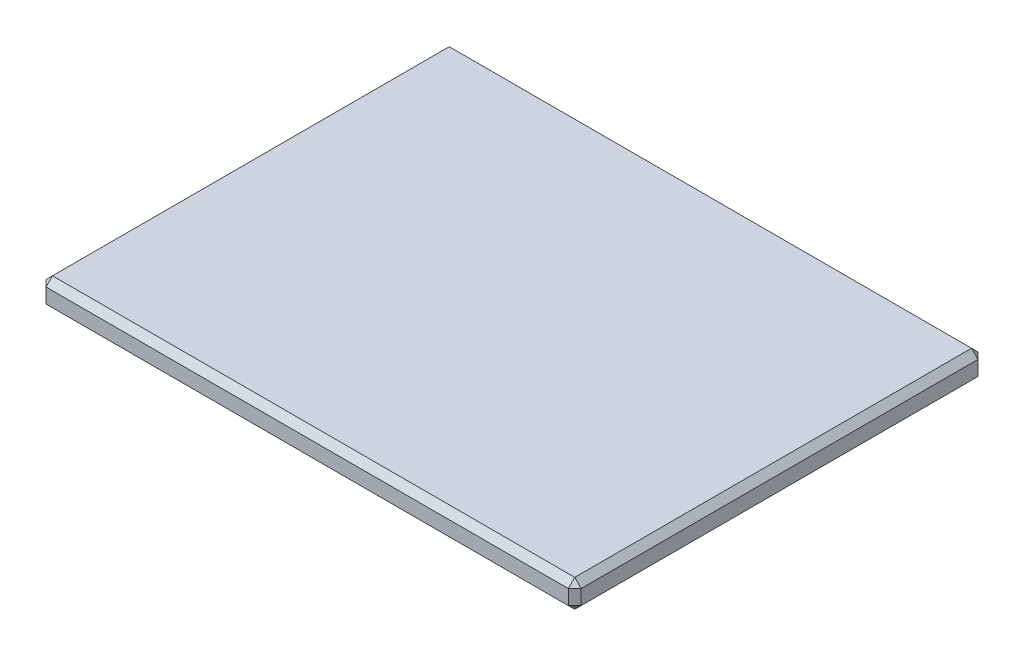
ISO-10303-21;
HEADER;
FILE_DESCRIPTION(('STEP AP214'),'2;1');
FILE_NAME('part.step','',(''),(''),'','','');
FILE_SCHEMA(('AUTOMOTIVE_DESIGN { 1 0 10303 214 1 1 1 1 }'));
ENDSEC;
DATA;
#1=APPLICATION_CONTEXT('core data for automotive mechanical design processes');
#2=APPLICATION_PROTOCOL_DEFINITION('international standard','automotive_design',2000,#1);
#3=PRODUCT_CONTEXT('',#1,'mechanical');
#4=PRODUCT('Part','Part','',(#3));
#5=PRODUCT_RELATED_PRODUCT_CATEGORY('part','',(#4));
#6=PRODUCT_DEFINITION_FORMATION('','',#4);
#7=PRODUCT_DEFINITION_CONTEXT('part definition',#1,'design');
#8=PRODUCT_DEFINITION('design','',#6,#7);
#9=PRODUCT_DEFINITION_SHAPE('','',#8);
#10=(LENGTH_UNIT() NAMED_UNIT(*) SI_UNIT(.MILLI.,.METRE.));
#11=(NAMED_UNIT(*) PLANE_ANGLE_UNIT() SI_UNIT($,.RADIAN.));
#12=(NAMED_UNIT(*) SI_UNIT($,.STERADIAN.) SOLID_ANGLE_UNIT());
#13=UNCERTAINTY_MEASURE_WITH_UNIT(LENGTH_MEASURE(1.E-05),#10,'distance_accuracy_value','');
#14=(GEOMETRIC_REPRESENTATION_CONTEXT(3) GLOBAL_UNCERTAINTY_ASSIGNED_CONTEXT((#13)) GLOBAL_UNIT_ASSIGNED_CONTEXT((#10,
#11,#12)) REPRESENTATION_CONTEXT('',''));
#15=CARTESIAN_POINT('',(0.,0.,0.));
#16=DIRECTION('',(0.,0.,1.));
#17=DIRECTION('',(1.,0.,0.));
#18=AXIS2_PLACEMENT_3D('',#15,#16,#17);
#19=CARTESIAN_POINT('',(36.83,-3.81,28.194));
#20=DIRECTION('',(1.,0.,0.));
#21=DIRECTION('',(0.,0.,-1.));
#22=AXIS2_PLACEMENT_3D('',#19,#20,#21);
#23=PLANE('',#22);
#24=DIRECTION('',(0.,0.,-1.));
#25=VECTOR('',#24,1.);
#26=CARTESIAN_POINT('',(36.83,-2.92099999999999,28.194));
#27=LINE('',#26,#25);
#28=CARTESIAN_POINT('',(36.83,-2.92099999999999,27.305));
#29=VERTEX_POINT('',#28);
#30=CARTESIAN_POINT('',(36.83,-2.92099999999999,-27.305));
#31=VERTEX_POINT('',#30);
#32=EDGE_CURVE('E231',#29,#31,#27,.T.);
#33=ORIENTED_EDGE('',*,*,#32,.T.);
#34=DIRECTION('',(0.,1.,0.));
#35=VECTOR('',#34,1.);
#36=CARTESIAN_POINT('',(36.83,-3.81,-27.305));
#37=LINE('',#36,#35);
#38=CARTESIAN_POINT('',(36.83,-0.889000000000015,-27.305));
#39=VERTEX_POINT('',#38);
#40=EDGE_CURVE('E238',#31,#39,#37,.T.);
#41=ORIENTED_EDGE('',*,*,#40,.T.);
#42=DIRECTION('',(0.,0.,1.));
#43=VECTOR('',#42,1.);
#44=CARTESIAN_POINT('',(36.83,-0.889000000000015,28.194));
#45=LINE('',#44,#43);
#46=CARTESIAN_POINT('',(36.83,-0.889000000000015,27.305));
#47=VERTEX_POINT('',#46);
#48=EDGE_CURVE('E239',#39,#47,#45,.T.);
#49=ORIENTED_EDGE('',*,*,#48,.T.);
#50=DIRECTION('',(0.,-1.,0.));
#51=VECTOR('',#50,1.);
#52=CARTESIAN_POINT('',(36.83,-3.81,27.305));
#53=LINE('',#52,#51);
#54=EDGE_CURVE('E243',#47,#29,#53,.T.);
#55=ORIENTED_EDGE('',*,*,#54,.T.);
#56=EDGE_LOOP('',(#33,#41,#49,#55));
#57=FACE_BOUND('',#56,.T.);
#58=ADVANCED_FACE('F35',(#57),#23,.T.);
#59=CARTESIAN_POINT('',(-36.83,-3.81,28.194));
#60=DIRECTION('',(0.,0.,1.));
#61=DIRECTION('',(1.,0.,0.));
#62=AXIS2_PLACEMENT_3D('',#59,#60,#61);
#63=PLANE('',#62);
#64=DIRECTION('',(1.,0.,0.));
#65=VECTOR('',#64,1.);
#66=CARTESIAN_POINT('',(-36.83,-2.92099999999999,28.194));
#67=LINE('',#66,#65);
#68=CARTESIAN_POINT('',(-35.941,-2.92099999999999,28.194));
#69=VERTEX_POINT('',#68);
#70=CARTESIAN_POINT('',(35.941,-2.92099999999999,28.194));
#71=VERTEX_POINT('',#70);
#72=EDGE_CURVE('E44',#69,#71,#67,.T.);
#73=ORIENTED_EDGE('',*,*,#72,.T.);
#74=DIRECTION('',(0.,1.,0.));
#75=VECTOR('',#74,1.);
#76=CARTESIAN_POINT('',(35.941,-3.81,28.194));
#77=LINE('',#76,#75);
#78=CARTESIAN_POINT('',(35.941,-0.889000000000015,28.194));
#79=VERTEX_POINT('',#78);
#80=EDGE_CURVE('E11',#71,#79,#77,.T.);
#81=ORIENTED_EDGE('',*,*,#80,.T.);
#82=DIRECTION('',(-1.,0.,0.));
#83=VECTOR('',#82,1.);
#84=CARTESIAN_POINT('',(-36.83,-0.889000000000015,28.194));
#85=LINE('',#84,#83);
#86=CARTESIAN_POINT('',(-35.941,-0.889000000000015,28.194));
#87=VERTEX_POINT('',#86);
#88=EDGE_CURVE('E210',#79,#87,#85,.T.);
#89=ORIENTED_EDGE('',*,*,#88,.T.);
#90=DIRECTION('',(0.,-1.,0.));
#91=VECTOR('',#90,1.);
#92=CARTESIAN_POINT('',(-35.941,-3.81,28.194));
#93=LINE('',#92,#91);
#94=EDGE_CURVE('E55',#87,#69,#93,.T.);
#95=ORIENTED_EDGE('',*,*,#94,.T.);
#96=EDGE_LOOP('',(#73,#81,#89,#95));
#97=FACE_BOUND('',#96,.T.);
#98=ADVANCED_FACE('F213',(#97),#63,.T.);
#99=CARTESIAN_POINT('',(-36.83,-3.81,28.194));
#100=DIRECTION('',(-1.,0.,0.));
#101=DIRECTION('',(0.,0.,1.));
#102=AXIS2_PLACEMENT_3D('',#99,#100,#101);
#103=PLANE('',#102);
#104=DIRECTION('',(0.,-1.,0.));
#105=VECTOR('',#104,1.);
#106=CARTESIAN_POINT('',(-36.83,-3.81,-27.305));
#107=LINE('',#106,#105);
#108=CARTESIAN_POINT('',(-36.83,-0.889000000000015,-27.305));
#109=VERTEX_POINT('',#108);
#110=CARTESIAN_POINT('',(-36.83,-2.92099999999999,-27.305));
#111=VERTEX_POINT('',#110);
#112=EDGE_CURVE('E155',#109,#111,#107,.T.);
#113=ORIENTED_EDGE('',*,*,#112,.T.);
#114=DIRECTION('',(0.,0.,1.));
#115=VECTOR('',#114,1.);
#116=CARTESIAN_POINT('',(-36.83,-2.92099999999999,28.194));
#117=LINE('',#116,#115);
#118=CARTESIAN_POINT('',(-36.83,-2.92099999999999,27.305));
#119=VERTEX_POINT('',#118);
#120=EDGE_CURVE('E291',#111,#119,#117,.T.);
#121=ORIENTED_EDGE('',*,*,#120,.T.);
#122=DIRECTION('',(0.,1.,0.));
#123=VECTOR('',#122,1.);
#124=CARTESIAN_POINT('',(-36.83,-3.81,27.305));
#125=LINE('',#124,#123);
#126=CARTESIAN_POINT('',(-36.83,-0.889000000000015,27.305));
#127=VERTEX_POINT('',#126);
#128=EDGE_CURVE('E283',#119,#127,#125,.T.);
#129=ORIENTED_EDGE('',*,*,#128,.T.);
#130=DIRECTION('',(0.,0.,-1.));
#131=VECTOR('',#130,1.);
#132=CARTESIAN_POINT('',(-36.83,-0.889000000000015,-28.194));
#133=LINE('',#132,#131);
#134=EDGE_CURVE('E285',#127,#109,#133,.T.);
#135=ORIENTED_EDGE('',*,*,#134,.T.);
#136=EDGE_LOOP('',(#113,#121,#129,#135));
#137=FACE_BOUND('',#136,.T.);
#138=ADVANCED_FACE('F337',(#137),#103,.T.);
#139=CARTESIAN_POINT('',(-36.83,-3.81,-28.194));
#140=DIRECTION('',(0.,0.,-1.));
#141=DIRECTION('',(-1.,0.,0.));
#142=AXIS2_PLACEMENT_3D('',#139,#140,#141);
#143=PLANE('',#142);
#144=DIRECTION('',(0.,-1.,0.));
#145=VECTOR('',#144,1.);
#146=CARTESIAN_POINT('',(35.941,-3.81,-28.194));
#147=LINE('',#146,#145);
#148=CARTESIAN_POINT('',(35.941,-0.889000000000015,-28.194));
#149=VERTEX_POINT('',#148);
#150=CARTESIAN_POINT('',(35.941,-2.92099999999999,-28.194));
#151=VERTEX_POINT('',#150);
#152=EDGE_CURVE('E133',#149,#151,#147,.T.);
#153=ORIENTED_EDGE('',*,*,#152,.T.);
#154=DIRECTION('',(-1.,0.,0.));
#155=VECTOR('',#154,1.);
#156=CARTESIAN_POINT('',(-36.83,-2.92099999999999,-28.194));
#157=LINE('',#156,#155);
#158=CARTESIAN_POINT('',(-35.941,-2.92099999999999,-28.194));
#159=VERTEX_POINT('',#158);
#160=EDGE_CURVE('E129',#151,#159,#157,.T.);
#161=ORIENTED_EDGE('',*,*,#160,.T.);
#162=DIRECTION('',(0.,1.,0.));
#163=VECTOR('',#162,1.);
#164=CARTESIAN_POINT('',(-35.941,-3.81,-28.194));
#165=LINE('',#164,#163);
#166=CARTESIAN_POINT('',(-35.941,-0.889000000000015,-28.194));
#167=VERTEX_POINT('',#166);
#168=EDGE_CURVE('E123',#159,#167,#165,.T.);
#169=ORIENTED_EDGE('',*,*,#168,.T.);
#170=DIRECTION('',(1.,0.,0.));
#171=VECTOR('',#170,1.);
#172=CARTESIAN_POINT('',(36.83,-0.889000000000015,-28.194));
#173=LINE('',#172,#171);
#174=EDGE_CURVE('E126',#167,#149,#173,.T.);
#175=ORIENTED_EDGE('',*,*,#174,.T.);
#176=EDGE_LOOP('',(#153,#161,#169,#175));
#177=FACE_BOUND('',#176,.T.);
#178=ADVANCED_FACE('F125',(#177),#143,.T.);
#179=CARTESIAN_POINT('',(36.83,-3.81,-28.194));
#180=DIRECTION('',(0.,-1.,0.));
#181=DIRECTION('',(0.,0.,-1.));
#182=AXIS2_PLACEMENT_3D('',#179,#180,#181);
#183=PLANE('',#182);
#184=DIRECTION('',(0.,0.,-1.));
#185=VECTOR('',#184,1.);
#186=CARTESIAN_POINT('',(-35.941,-3.81,-28.194));
#187=LINE('',#186,#185);
#188=CARTESIAN_POINT('',(-35.941,-3.81,27.305));
#189=VERTEX_POINT('',#188);
#190=CARTESIAN_POINT('',(-35.941,-3.81,-27.305));
#191=VERTEX_POINT('',#190);
#192=EDGE_CURVE('E274',#189,#191,#187,.T.);
#193=ORIENTED_EDGE('',*,*,#192,.T.);
#194=DIRECTION('',(1.,0.,0.));
#195=VECTOR('',#194,1.);
#196=CARTESIAN_POINT('',(36.83,-3.81,-27.305));
#197=LINE('',#196,#195);
#198=CARTESIAN_POINT('',(35.941,-3.81,-27.305));
#199=VERTEX_POINT('',#198);
#200=EDGE_CURVE('E277',#191,#199,#197,.T.);
#201=ORIENTED_EDGE('',*,*,#200,.T.);
#202=DIRECTION('',(0.,0.,1.));
#203=VECTOR('',#202,1.);
#204=CARTESIAN_POINT('',(35.941,-3.81,-28.194));
#205=LINE('',#204,#203);
#206=CARTESIAN_POINT('',(35.941,-3.81,27.305));
#207=VERTEX_POINT('',#206);
#208=EDGE_CURVE('E271',#199,#207,#205,.T.);
#209=ORIENTED_EDGE('',*,*,#208,.T.);
#210=DIRECTION('',(-1.,0.,0.));
#211=VECTOR('',#210,1.);
#212=CARTESIAN_POINT('',(36.83,-3.81,27.305));
#213=LINE('',#212,#211);
#214=EDGE_CURVE('E224',#207,#189,#213,.T.);
#215=ORIENTED_EDGE('',*,*,#214,.T.);
#216=EDGE_LOOP('',(#193,#201,#209,#215));
#217=FACE_BOUND('',#216,.T.);
#218=ADVANCED_FACE('F278',(#217),#183,.T.);
#219=CARTESIAN_POINT('',(36.83,0.,-28.194));
#220=DIRECTION('',(0.,-1.,0.));
#221=DIRECTION('',(0.,0.,-1.));
#222=AXIS2_PLACEMENT_3D('',#219,#220,#221);
#223=PLANE('',#222);
#224=DIRECTION('',(-1.,0.,0.));
#225=VECTOR('',#224,1.);
#226=CARTESIAN_POINT('',(-36.83,0.,-27.305));
#227=LINE('',#226,#225);
#228=CARTESIAN_POINT('',(35.941,0.,-27.305));
#229=VERTEX_POINT('',#228);
#230=CARTESIAN_POINT('',(-35.941,0.,-27.305));
#231=VERTEX_POINT('',#230);
#232=EDGE_CURVE('E250',#229,#231,#227,.T.);
#233=ORIENTED_EDGE('',*,*,#232,.T.);
#234=DIRECTION('',(0.,0.,1.));
#235=VECTOR('',#234,1.);
#236=CARTESIAN_POINT('',(-35.941,0.,28.194));
#237=LINE('',#236,#235);
#238=CARTESIAN_POINT('',(-35.941,0.,27.305));
#239=VERTEX_POINT('',#238);
#240=EDGE_CURVE('E211',#231,#239,#237,.T.);
#241=ORIENTED_EDGE('',*,*,#240,.T.);
#242=DIRECTION('',(1.,0.,0.));
#243=VECTOR('',#242,1.);
#244=CARTESIAN_POINT('',(36.83,0.,27.305));
#245=LINE('',#244,#243);
#246=CARTESIAN_POINT('',(35.941,0.,27.305));
#247=VERTEX_POINT('',#246);
#248=EDGE_CURVE('E241',#239,#247,#245,.T.);
#249=ORIENTED_EDGE('',*,*,#248,.T.);
#250=DIRECTION('',(0.,0.,-1.));
#251=VECTOR('',#250,1.);
#252=CARTESIAN_POINT('',(35.941,0.,-28.194));
#253=LINE('',#252,#251);
#254=EDGE_CURVE('E248',#247,#229,#253,.T.);
#255=ORIENTED_EDGE('',*,*,#254,.T.);
#256=EDGE_LOOP('',(#233,#241,#249,#255));
#257=FACE_BOUND('',#256,.T.);
#258=ADVANCED_FACE('F298',(#257),#223,.F.);
#259=CARTESIAN_POINT('',(36.83,0.,27.305));
#260=DIRECTION('',(0.,0.707106781186547,0.707106781186547));
#261=DIRECTION('',(0.,-0.707106781186548,0.707106781186548));
#262=AXIS2_PLACEMENT_3D('',#259,#260,#261);
#263=PLANE('',#262);
#264=DIRECTION('',(0.,-0.707106781186548,0.707106781186548));
#265=VECTOR('',#264,1.);
#266=CARTESIAN_POINT('',(35.941,-0.444500000000001,27.7495));
#267=LINE('',#266,#265);
#268=EDGE_CURVE('E39',#247,#79,#267,.T.);
#269=ORIENTED_EDGE('',*,*,#268,.F.);
#270=ORIENTED_EDGE('',*,*,#248,.F.);
#271=DIRECTION('',(0.,0.707106781186547,-0.707106781186547));
#272=VECTOR('',#271,1.);
#273=CARTESIAN_POINT('',(-35.941,0.,27.305));
#274=LINE('',#273,#272);
#275=EDGE_CURVE('E193',#87,#239,#274,.T.);
#276=ORIENTED_EDGE('',*,*,#275,.F.);
#277=ORIENTED_EDGE('',*,*,#88,.F.);
#278=EDGE_LOOP('',(#269,#270,#276,#277));
#279=FACE_BOUND('',#278,.T.);
#280=ADVANCED_FACE('F37',(#279),#263,.T.);
#281=CARTESIAN_POINT('',(36.83,-0.889000000000015,27.305));
#282=DIRECTION('',(0.577350269189623,0.577350269189623,0.577350269189632));
#283=DIRECTION('',(0.707106781186553,0.,-0.707106781186542));
#284=AXIS2_PLACEMENT_3D('',#281,#282,#283);
#285=PLANE('',#284);
#286=DIRECTION('',(-0.707106781186548,0.707106781186548,0.));
#287=VECTOR('',#286,1.);
#288=CARTESIAN_POINT('',(36.83,-0.889000000000015,27.305));
#289=LINE('',#288,#287);
#290=EDGE_CURVE('E189',#247,#47,#289,.F.);
#291=ORIENTED_EDGE('',*,*,#290,.F.);
#292=ORIENTED_EDGE('',*,*,#268,.T.);
#293=DIRECTION('',(-0.707106781186553,0.,0.707106781186542));
#294=VECTOR('',#293,1.);
#295=CARTESIAN_POINT('',(36.83,-0.889000000000015,27.305));
#296=LINE('',#295,#294);
#297=EDGE_CURVE('E192',#47,#79,#296,.T.);
#298=ORIENTED_EDGE('',*,*,#297,.F.);
#299=EDGE_LOOP('',(#291,#292,#298));
#300=FACE_BOUND('',#299,.T.);
#301=ADVANCED_FACE('F206',(#300),#285,.T.);
#302=CARTESIAN_POINT('',(-35.941,0.,27.305));
#303=DIRECTION('',(-0.577350269189626,0.577350269189626,0.577350269189626));
#304=DIRECTION('',(0.707106781186547,0.,0.707106781186547));
#305=AXIS2_PLACEMENT_3D('',#302,#303,#304);
#306=PLANE('',#305);
#307=DIRECTION('',(-0.707106781186547,0.,-0.707106781186547));
#308=VECTOR('',#307,1.);
#309=CARTESIAN_POINT('',(-36.3855,-0.889000000000015,27.7495));
#310=LINE('',#309,#308);
#311=EDGE_CURVE('E184',#87,#127,#310,.T.);
#312=ORIENTED_EDGE('',*,*,#311,.F.);
#313=ORIENTED_EDGE('',*,*,#275,.T.);
#314=DIRECTION('',(-0.707106781186547,-0.707106781186547,0.));
#315=VECTOR('',#314,1.);
#316=CARTESIAN_POINT('',(-35.941,0.,27.305));
#317=LINE('',#316,#315);
#318=EDGE_CURVE('E187',#127,#239,#317,.F.);
#319=ORIENTED_EDGE('',*,*,#318,.F.);
#320=EDGE_LOOP('',(#312,#313,#319));
#321=FACE_BOUND('',#320,.T.);
#322=ADVANCED_FACE('F303',(#321),#306,.T.);
#323=CARTESIAN_POINT('',(35.941,-3.81,28.194));
#324=DIRECTION('',(-0.707106781186542,0.,-0.707106781186553));
#325=DIRECTION('',(-0.707106781186553,0.,0.707106781186542));
#326=AXIS2_PLACEMENT_3D('',#323,#324,#325);
#327=PLANE('',#326);
#328=ORIENTED_EDGE('',*,*,#297,.T.);
#329=ORIENTED_EDGE('',*,*,#80,.F.);
#330=DIRECTION('',(0.707106781186553,0.,-0.707106781186542));
#331=VECTOR('',#330,1.);
#332=CARTESIAN_POINT('',(36.3855,-2.92099999999999,27.7495));
#333=LINE('',#332,#331);
#334=EDGE_CURVE('E178',#29,#71,#333,.F.);
#335=ORIENTED_EDGE('',*,*,#334,.F.);
#336=ORIENTED_EDGE('',*,*,#54,.F.);
#337=EDGE_LOOP('',(#328,#329,#335,#336));
#338=FACE_BOUND('',#337,.T.);
#339=ADVANCED_FACE('F217',(#338),#327,.F.);
#340=CARTESIAN_POINT('',(35.941,0.,-28.194));
#341=DIRECTION('',(0.707106781186547,0.707106781186547,0.));
#342=DIRECTION('',(-0.707106781186548,0.707106781186548,0.));
#343=AXIS2_PLACEMENT_3D('',#340,#341,#342);
#344=PLANE('',#343);
#345=ORIENTED_EDGE('',*,*,#290,.T.);
#346=ORIENTED_EDGE('',*,*,#48,.F.);
#347=DIRECTION('',(0.707106781186548,-0.707106781186548,0.));
#348=VECTOR('',#347,1.);
#349=CARTESIAN_POINT('',(36.83,-0.889000000000015,-27.305));
#350=LINE('',#349,#348);
#351=EDGE_CURVE('E175',#229,#39,#350,.T.);
#352=ORIENTED_EDGE('',*,*,#351,.F.);
#353=ORIENTED_EDGE('',*,*,#254,.F.);
#354=EDGE_LOOP('',(#345,#346,#352,#353));
#355=FACE_BOUND('',#354,.T.);
#356=ADVANCED_FACE('F296',(#355),#344,.T.);
#357=CARTESIAN_POINT('',(36.83,0.,-27.305));
#358=DIRECTION('',(0.,0.707106781186547,-0.707106781186547));
#359=DIRECTION('',(0.,0.707106781186548,0.707106781186548));
#360=AXIS2_PLACEMENT_3D('',#357,#358,#359);
#361=PLANE('',#360);
#362=DIRECTION('',(0.,-0.707106781186547,-0.707106781186547));
#363=VECTOR('',#362,1.);
#364=CARTESIAN_POINT('',(-35.941,-0.889000000000015,-28.194));
#365=LINE('',#364,#363);
#366=EDGE_CURVE('E140',#231,#167,#365,.T.);
#367=ORIENTED_EDGE('',*,*,#366,.F.);
#368=ORIENTED_EDGE('',*,*,#232,.F.);
#369=DIRECTION('',(0.,0.707106781186548,0.707106781186548));
#370=VECTOR('',#369,1.);
#371=CARTESIAN_POINT('',(35.941,-0.444500000000001,-27.7495));
#372=LINE('',#371,#370);
#373=EDGE_CURVE('E143',#149,#229,#372,.T.);
#374=ORIENTED_EDGE('',*,*,#373,.F.);
#375=ORIENTED_EDGE('',*,*,#174,.F.);
#376=EDGE_LOOP('',(#367,#368,#374,#375));
#377=FACE_BOUND('',#376,.T.);
#378=ADVANCED_FACE('F138',(#377),#361,.T.);
#379=CARTESIAN_POINT('',(-35.941,0.,-28.194));
#380=DIRECTION('',(-0.707106781186547,0.707106781186547,0.));
#381=DIRECTION('',(-0.707106781186548,-0.707106781186548,0.));
#382=AXIS2_PLACEMENT_3D('',#379,#380,#381);
#383=PLANE('',#382);
#384=ORIENTED_EDGE('',*,*,#318,.T.);
#385=ORIENTED_EDGE('',*,*,#240,.F.);
#386=DIRECTION('',(0.707106781186547,0.707106781186547,0.));
#387=VECTOR('',#386,1.);
#388=CARTESIAN_POINT('',(-36.3855,-0.444500000000007,-27.305));
#389=LINE('',#388,#387);
#390=EDGE_CURVE('E152',#109,#231,#389,.T.);
#391=ORIENTED_EDGE('',*,*,#390,.F.);
#392=ORIENTED_EDGE('',*,*,#134,.F.);
#393=EDGE_LOOP('',(#384,#385,#391,#392));
#394=FACE_BOUND('',#393,.T.);
#395=ADVANCED_FACE('F301',(#394),#383,.T.);
#396=CARTESIAN_POINT('',(-36.83,-3.81,27.305));
#397=DIRECTION('',(0.707106781186547,0.,-0.707106781186547));
#398=DIRECTION('',(-0.707106781186548,0.,-0.707106781186548));
#399=AXIS2_PLACEMENT_3D('',#396,#397,#398);
#400=PLANE('',#399);
#401=ORIENTED_EDGE('',*,*,#311,.T.);
#402=ORIENTED_EDGE('',*,*,#128,.F.);
#403=DIRECTION('',(0.707106781186547,0.,0.707106781186547));
#404=VECTOR('',#403,1.);
#405=CARTESIAN_POINT('',(-36.83,-2.92099999999999,27.305));
#406=LINE('',#405,#404);
#407=EDGE_CURVE('E170',#69,#119,#406,.F.);
#408=ORIENTED_EDGE('',*,*,#407,.F.);
#409=ORIENTED_EDGE('',*,*,#94,.F.);
#410=EDGE_LOOP('',(#401,#402,#408,#409));
#411=FACE_BOUND('',#410,.T.);
#412=ADVANCED_FACE('F306',(#411),#400,.F.);
#413=CARTESIAN_POINT('',(-36.83,-2.92099999999999,28.194));
#414=DIRECTION('',(0.,0.707106781186547,-0.707106781186547));
#415=DIRECTION('',(0.,0.707106781186548,0.707106781186548));
#416=AXIS2_PLACEMENT_3D('',#413,#414,#415);
#417=PLANE('',#416);
#418=DIRECTION('',(0.,0.707106781186548,0.707106781186548));
#419=VECTOR('',#418,1.);
#420=CARTESIAN_POINT('',(35.941,-3.81,27.305));
#421=LINE('',#420,#419);
#422=EDGE_CURVE('E181',#71,#207,#421,.F.);
#423=ORIENTED_EDGE('',*,*,#422,.F.);
#424=ORIENTED_EDGE('',*,*,#72,.F.);
#425=DIRECTION('',(0.,-0.707106781186547,-0.707106781186547));
#426=VECTOR('',#425,1.);
#427=CARTESIAN_POINT('',(-35.941,-3.36549999999999,27.7495));
#428=LINE('',#427,#426);
#429=EDGE_CURVE('E167',#189,#69,#428,.F.);
#430=ORIENTED_EDGE('',*,*,#429,.F.);
#431=ORIENTED_EDGE('',*,*,#214,.F.);
#432=EDGE_LOOP('',(#423,#424,#430,#431));
#433=FACE_BOUND('',#432,.T.);
#434=ADVANCED_FACE('F221',(#433),#417,.F.);
#435=CARTESIAN_POINT('',(35.941,-3.81,27.305));
#436=DIRECTION('',(0.577350269189623,-0.577350269189623,0.577350269189632));
#437=DIRECTION('',(0.707106781186553,0.,-0.707106781186542));
#438=AXIS2_PLACEMENT_3D('',#435,#436,#437);
#439=PLANE('',#438);
#440=ORIENTED_EDGE('',*,*,#334,.T.);
#441=ORIENTED_EDGE('',*,*,#422,.T.);
#442=DIRECTION('',(-0.707106781186547,-0.707106781186547,0.));
#443=VECTOR('',#442,1.);
#444=CARTESIAN_POINT('',(35.941,-3.81,27.305));
#445=LINE('',#444,#443);
#446=EDGE_CURVE('E159',#29,#207,#445,.T.);
#447=ORIENTED_EDGE('',*,*,#446,.F.);
#448=EDGE_LOOP('',(#440,#441,#447));
#449=FACE_BOUND('',#448,.T.);
#450=ADVANCED_FACE('F226',(#449),#439,.T.);
#451=CARTESIAN_POINT('',(36.83,-0.889000000000015,-27.305));
#452=DIRECTION('',(0.577350269189623,0.577350269189623,-0.577350269189632));
#453=DIRECTION('',(-0.707106781186553,0.,-0.707106781186542));
#454=AXIS2_PLACEMENT_3D('',#451,#452,#453);
#455=PLANE('',#454);
#456=ORIENTED_EDGE('',*,*,#373,.T.);
#457=ORIENTED_EDGE('',*,*,#351,.T.);
#458=DIRECTION('',(0.707106781186553,0.,0.707106781186542));
#459=VECTOR('',#458,1.);
#460=CARTESIAN_POINT('',(36.83,-0.889000000000015,-27.305));
#461=LINE('',#460,#459);
#462=EDGE_CURVE('E156',#149,#39,#461,.T.);
#463=ORIENTED_EDGE('',*,*,#462,.F.);
#464=EDGE_LOOP('',(#456,#457,#463));
#465=FACE_BOUND('',#464,.T.);
#466=ADVANCED_FACE('F323',(#465),#455,.T.);
#467=CARTESIAN_POINT('',(-35.941,-0.889000000000015,-28.194));
#468=DIRECTION('',(-0.577350269189626,0.577350269189626,-0.577350269189626));
#469=DIRECTION('',(-0.707106781186547,0.,0.707106781186547));
#470=AXIS2_PLACEMENT_3D('',#467,#468,#469);
#471=PLANE('',#470);
#472=ORIENTED_EDGE('',*,*,#390,.T.);
#473=ORIENTED_EDGE('',*,*,#366,.T.);
#474=DIRECTION('',(0.707106781186547,0.,-0.707106781186547));
#475=VECTOR('',#474,1.);
#476=CARTESIAN_POINT('',(-35.941,-0.889000000000015,-28.194));
#477=LINE('',#476,#475);
#478=EDGE_CURVE('E149',#109,#167,#477,.T.);
#479=ORIENTED_EDGE('',*,*,#478,.F.);
#480=EDGE_LOOP('',(#472,#473,#479));
#481=FACE_BOUND('',#480,.T.);
#482=ADVANCED_FACE('F148',(#481),#471,.T.);
#483=CARTESIAN_POINT('',(-36.83,-2.92099999999999,27.305));
#484=DIRECTION('',(-0.577350269189626,-0.577350269189626,0.577350269189626));
#485=DIRECTION('',(0.707106781186547,0.,0.707106781186547));
#486=AXIS2_PLACEMENT_3D('',#483,#484,#485);
#487=PLANE('',#486);
#488=ORIENTED_EDGE('',*,*,#429,.T.);
#489=ORIENTED_EDGE('',*,*,#407,.T.);
#490=DIRECTION('',(-0.707106781186547,0.707106781186547,0.));
#491=VECTOR('',#490,1.);
#492=CARTESIAN_POINT('',(-36.83,-2.92099999999999,27.305));
#493=LINE('',#492,#491);
#494=EDGE_CURVE('E157',#189,#119,#493,.T.);
#495=ORIENTED_EDGE('',*,*,#494,.F.);
#496=EDGE_LOOP('',(#488,#489,#495));
#497=FACE_BOUND('',#496,.T.);
#498=ADVANCED_FACE('F309',(#497),#487,.T.);
#499=CARTESIAN_POINT('',(36.83,-2.92099999999999,28.194));
#500=DIRECTION('',(-0.707106781186547,0.707106781186547,0.));
#501=DIRECTION('',(-0.707106781186548,-0.707106781186548,0.));
#502=AXIS2_PLACEMENT_3D('',#499,#500,#501);
#503=PLANE('',#502);
#504=ORIENTED_EDGE('',*,*,#446,.T.);
#505=ORIENTED_EDGE('',*,*,#208,.F.);
#506=DIRECTION('',(0.707106781186547,0.707106781186547,0.));
#507=VECTOR('',#506,1.);
#508=CARTESIAN_POINT('',(35.941,-3.81,-27.305));
#509=LINE('',#508,#507);
#510=EDGE_CURVE('E161',#31,#199,#509,.F.);
#511=ORIENTED_EDGE('',*,*,#510,.F.);
#512=ORIENTED_EDGE('',*,*,#32,.F.);
#513=EDGE_LOOP('',(#504,#505,#511,#512));
#514=FACE_BOUND('',#513,.T.);
#515=ADVANCED_FACE('F232',(#514),#503,.F.);
#516=CARTESIAN_POINT('',(36.83,-3.81,-27.305));
#517=DIRECTION('',(-0.707106781186542,0.,0.707106781186553));
#518=DIRECTION('',(0.707106781186553,0.,0.707106781186542));
#519=AXIS2_PLACEMENT_3D('',#516,#517,#518);
#520=PLANE('',#519);
#521=ORIENTED_EDGE('',*,*,#462,.T.);
#522=ORIENTED_EDGE('',*,*,#40,.F.);
#523=DIRECTION('',(-0.707106781186553,0.,-0.707106781186542));
#524=VECTOR('',#523,1.);
#525=CARTESIAN_POINT('',(36.3855,-2.92099999999999,-27.7495));
#526=LINE('',#525,#524);
#527=EDGE_CURVE('E266',#151,#31,#526,.F.);
#528=ORIENTED_EDGE('',*,*,#527,.F.);
#529=ORIENTED_EDGE('',*,*,#152,.F.);
#530=EDGE_LOOP('',(#521,#522,#528,#529));
#531=FACE_BOUND('',#530,.T.);
#532=ADVANCED_FACE('F321',(#531),#520,.F.);
#533=CARTESIAN_POINT('',(-35.941,-3.81,-28.194));
#534=DIRECTION('',(0.707106781186547,0.,0.707106781186547));
#535=DIRECTION('',(0.707106781186548,0.,-0.707106781186548));
#536=AXIS2_PLACEMENT_3D('',#533,#534,#535);
#537=PLANE('',#536);
#538=ORIENTED_EDGE('',*,*,#478,.T.);
#539=ORIENTED_EDGE('',*,*,#168,.F.);
#540=DIRECTION('',(-0.707106781186547,0.,0.707106781186547));
#541=VECTOR('',#540,1.);
#542=CARTESIAN_POINT('',(-35.941,-2.92099999999999,-28.194));
#543=LINE('',#542,#541);
#544=EDGE_CURVE('E263',#111,#159,#543,.F.);
#545=ORIENTED_EDGE('',*,*,#544,.F.);
#546=ORIENTED_EDGE('',*,*,#112,.F.);
#547=EDGE_LOOP('',(#538,#539,#545,#546));
#548=FACE_BOUND('',#547,.T.);
#549=ADVANCED_FACE('F154',(#548),#537,.F.);
#550=CARTESIAN_POINT('',(-36.83,-2.92099999999999,28.194));
#551=DIRECTION('',(0.707106781186547,0.707106781186547,0.));
#552=DIRECTION('',(-0.707106781186548,0.707106781186548,0.));
#553=AXIS2_PLACEMENT_3D('',#550,#551,#552);
#554=PLANE('',#553);
#555=ORIENTED_EDGE('',*,*,#494,.T.);
#556=ORIENTED_EDGE('',*,*,#120,.F.);
#557=DIRECTION('',(0.707106781186547,-0.707106781186547,0.));
#558=VECTOR('',#557,1.);
#559=CARTESIAN_POINT('',(-36.3855,-3.36549999999999,-27.305));
#560=LINE('',#559,#558);
#561=EDGE_CURVE('E260',#191,#111,#560,.F.);
#562=ORIENTED_EDGE('',*,*,#561,.F.);
#563=ORIENTED_EDGE('',*,*,#192,.F.);
#564=EDGE_LOOP('',(#555,#556,#562,#563));
#565=FACE_BOUND('',#564,.T.);
#566=ADVANCED_FACE('F312',(#565),#554,.F.);
#567=CARTESIAN_POINT('',(35.941,-3.81,-27.305));
#568=DIRECTION('',(0.577350269189623,-0.577350269189623,-0.577350269189632));
#569=DIRECTION('',(-0.707106781186553,0.,-0.707106781186542));
#570=AXIS2_PLACEMENT_3D('',#567,#568,#569);
#571=PLANE('',#570);
#572=ORIENTED_EDGE('',*,*,#527,.T.);
#573=ORIENTED_EDGE('',*,*,#510,.T.);
#574=DIRECTION('',(0.,-0.707106781186548,0.707106781186548));
#575=VECTOR('',#574,1.);
#576=CARTESIAN_POINT('',(35.941,-3.81,-27.305));
#577=LINE('',#576,#575);
#578=EDGE_CURVE('E258',#151,#199,#577,.T.);
#579=ORIENTED_EDGE('',*,*,#578,.F.);
#580=EDGE_LOOP('',(#572,#573,#579));
#581=FACE_BOUND('',#580,.T.);
#582=ADVANCED_FACE('F269',(#581),#571,.T.);
#583=CARTESIAN_POINT('',(-35.941,-2.92099999999999,-28.194));
#584=DIRECTION('',(-0.577350269189626,-0.577350269189626,-0.577350269189626));
#585=DIRECTION('',(-0.707106781186547,0.,0.707106781186547));
#586=AXIS2_PLACEMENT_3D('',#583,#584,#585);
#587=PLANE('',#586);
#588=ORIENTED_EDGE('',*,*,#561,.T.);
#589=ORIENTED_EDGE('',*,*,#544,.T.);
#590=DIRECTION('',(0.,0.707106781186547,-0.707106781186547));
#591=VECTOR('',#590,1.);
#592=CARTESIAN_POINT('',(-35.941,-2.92099999999999,-28.194));
#593=LINE('',#592,#591);
#594=EDGE_CURVE('E256',#191,#159,#593,.T.);
#595=ORIENTED_EDGE('',*,*,#594,.F.);
#596=EDGE_LOOP('',(#588,#589,#595));
#597=FACE_BOUND('',#596,.T.);
#598=ADVANCED_FACE('F314',(#597),#587,.T.);
#599=CARTESIAN_POINT('',(-36.83,-2.92099999999999,-28.194));
#600=DIRECTION('',(0.,0.707106781186547,0.707106781186547));
#601=DIRECTION('',(0.,-0.707106781186548,0.707106781186548));
#602=AXIS2_PLACEMENT_3D('',#599,#600,#601);
#603=PLANE('',#602);
#604=ORIENTED_EDGE('',*,*,#578,.T.);
#605=ORIENTED_EDGE('',*,*,#200,.F.);
#606=ORIENTED_EDGE('',*,*,#594,.T.);
#607=ORIENTED_EDGE('',*,*,#160,.F.);
#608=EDGE_LOOP('',(#604,#605,#606,#607));
#609=FACE_BOUND('',#608,.T.);
#610=ADVANCED_FACE('F315',(#609),#603,.F.);
#611=CLOSED_SHELL('',(#58,#98,#138,#178,#218,#258,#280,#301,#322,#339,#356,#378,#395,#412,#434,
#450,#466,#482,#498,#515,#532,#549,#566,#582,#598,#610));
#612=MANIFOLD_SOLID_BREP('B2',#611);
#613=ADVANCED_BREP_SHAPE_REPRESENTATION('',(#18,#612),#14);
#614=SHAPE_DEFINITION_REPRESENTATION(#9,#613);
ENDSEC;
END-ISO-10303-21;
